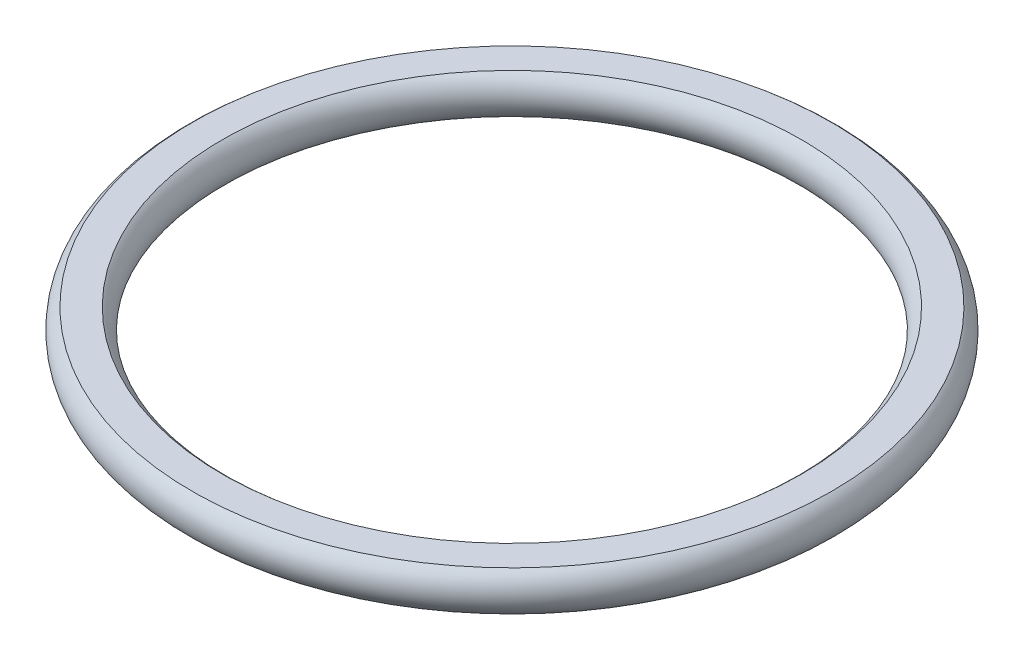
ISO-10303-21;
HEADER;
FILE_DESCRIPTION(('STEP AP214'),'2;1');
FILE_NAME('part.step','',(''),(''),'','','');
FILE_SCHEMA(('AUTOMOTIVE_DESIGN { 1 0 10303 214 1 1 1 1 }'));
ENDSEC;
DATA;
#1=APPLICATION_CONTEXT('core data for automotive mechanical design processes');
#2=APPLICATION_PROTOCOL_DEFINITION('international standard','automotive_design',2000,#1);
#3=PRODUCT_CONTEXT('',#1,'mechanical');
#4=PRODUCT('Part','Part','',(#3));
#5=PRODUCT_RELATED_PRODUCT_CATEGORY('part','',(#4));
#6=PRODUCT_DEFINITION_FORMATION('','',#4);
#7=PRODUCT_DEFINITION_CONTEXT('part definition',#1,'design');
#8=PRODUCT_DEFINITION('design','',#6,#7);
#9=PRODUCT_DEFINITION_SHAPE('','',#8);
#10=(LENGTH_UNIT() NAMED_UNIT(*) SI_UNIT(.MILLI.,.METRE.));
#11=(NAMED_UNIT(*) PLANE_ANGLE_UNIT() SI_UNIT($,.RADIAN.));
#12=(NAMED_UNIT(*) SI_UNIT($,.STERADIAN.) SOLID_ANGLE_UNIT());
#13=UNCERTAINTY_MEASURE_WITH_UNIT(LENGTH_MEASURE(1.E-05),#10,'distance_accuracy_value','');
#14=(GEOMETRIC_REPRESENTATION_CONTEXT(3) GLOBAL_UNCERTAINTY_ASSIGNED_CONTEXT((#13)) GLOBAL_UNIT_ASSIGNED_CONTEXT((#10,
#11,#12)) REPRESENTATION_CONTEXT('',''));
#15=CARTESIAN_POINT('',(0.,0.,0.));
#16=DIRECTION('',(0.,0.,1.));
#17=DIRECTION('',(1.,0.,0.));
#18=AXIS2_PLACEMENT_3D('',#15,#16,#17);
#19=CARTESIAN_POINT('',(30.5,-2.,0.));
#20=DIRECTION('',(0.,-1.,0.));
#21=DIRECTION('',(0.,0.,-1.));
#22=AXIS2_PLACEMENT_3D('',#19,#20,#21);
#23=PLANE('',#22);
#24=CARTESIAN_POINT('',(30.5,-2.,0.));
#25=DIRECTION('',(0.,-1.,0.));
#26=DIRECTION('',(-1.,0.,0.));
#27=AXIS2_PLACEMENT_3D('',#24,#25,#26);
#28=CIRCLE('',#27,29.);
#29=CARTESIAN_POINT('',(59.5,-2.,0.));
#30=VERTEX_POINT('',#29);
#31=EDGE_CURVE('E11',#30,#30,#28,.T.);
#32=ORIENTED_EDGE('',*,*,#31,.F.);
#33=EDGE_LOOP('',(#32));
#34=FACE_BOUND('',#33,.T.);
#35=CARTESIAN_POINT('',(30.5,-2.,0.));
#36=DIRECTION('',(0.,1.,0.));
#37=DIRECTION('',(-1.,0.,0.));
#38=AXIS2_PLACEMENT_3D('',#35,#36,#37);
#39=CIRCLE('',#38,32.);
#40=CARTESIAN_POINT('',(62.5,-2.,0.));
#41=VERTEX_POINT('',#40);
#42=EDGE_CURVE('E53',#41,#41,#39,.T.);
#43=ORIENTED_EDGE('',*,*,#42,.F.);
#44=EDGE_LOOP('',(#43));
#45=FACE_BOUND('',#44,.T.);
#46=ADVANCED_FACE('F17',(#34,#45),#23,.T.);
#47=CARTESIAN_POINT('',(30.5,0.,0.));
#48=DIRECTION('',(0.,-1.,0.));
#49=DIRECTION('',(-1.,0.,0.));
#50=AXIS2_PLACEMENT_3D('',#47,#48,#49);
#51=TOROIDAL_SURFACE('',#50,30.5,2.5);
#52=CARTESIAN_POINT('',(30.5,2.,0.));
#53=DIRECTION('',(0.,-1.,0.));
#54=DIRECTION('',(-1.,0.,0.));
#55=AXIS2_PLACEMENT_3D('',#52,#53,#54);
#56=CIRCLE('',#55,29.);
#57=CARTESIAN_POINT('',(59.5,2.,0.));
#58=VERTEX_POINT('',#57);
#59=EDGE_CURVE('E20',#58,#58,#56,.T.);
#60=ORIENTED_EDGE('',*,*,#59,.F.);
#61=CARTESIAN_POINT('',(61.,0.,0.));
#62=DIRECTION('',(0.,0.,1.));
#63=DIRECTION('',(1.,0.,0.));
#64=AXIS2_PLACEMENT_3D('',#61,#62,#63);
#65=CIRCLE('',#64,2.5);
#66=EDGE_CURVE('E27',#58,#30,#65,.T.);
#67=ORIENTED_EDGE('',*,*,#66,.T.);
#68=ORIENTED_EDGE('',*,*,#31,.T.);
#69=ORIENTED_EDGE('',*,*,#66,.F.);
#70=EDGE_LOOP('',(#60,#67,#68,#69));
#71=FACE_BOUND('',#70,.T.);
#72=ADVANCED_FACE('F76',(#71),#51,.T.);
#73=CARTESIAN_POINT('',(30.5,2.,0.));
#74=DIRECTION('',(0.,-1.,0.));
#75=DIRECTION('',(0.,0.,-1.));
#76=AXIS2_PLACEMENT_3D('',#73,#74,#75);
#77=PLANE('',#76);
#78=ORIENTED_EDGE('',*,*,#59,.T.);
#79=EDGE_LOOP('',(#78));
#80=FACE_BOUND('',#79,.T.);
#81=CARTESIAN_POINT('',(30.5,2.,0.));
#82=DIRECTION('',(0.,-1.,0.));
#83=DIRECTION('',(-1.,0.,0.));
#84=AXIS2_PLACEMENT_3D('',#81,#82,#83);
#85=CIRCLE('',#84,32.);
#86=CARTESIAN_POINT('',(62.5,2.,0.));
#87=VERTEX_POINT('',#86);
#88=EDGE_CURVE('E55',#87,#87,#85,.T.);
#89=ORIENTED_EDGE('',*,*,#88,.F.);
#90=EDGE_LOOP('',(#89));
#91=FACE_BOUND('',#90,.T.);
#92=ADVANCED_FACE('F74',(#80,#91),#77,.F.);
#93=CARTESIAN_POINT('',(30.5,0.,0.));
#94=DIRECTION('',(0.,-1.,0.));
#95=DIRECTION('',(-1.,0.,0.));
#96=AXIS2_PLACEMENT_3D('',#93,#94,#95);
#97=TOROIDAL_SURFACE('',#96,30.5,2.5);
#98=ORIENTED_EDGE('',*,*,#42,.T.);
#99=CARTESIAN_POINT('',(61.,0.,0.));
#100=DIRECTION('',(0.,0.,1.));
#101=DIRECTION('',(1.,0.,0.));
#102=AXIS2_PLACEMENT_3D('',#99,#100,#101);
#103=CIRCLE('',#102,2.5);
#104=EDGE_CURVE('E50',#41,#87,#103,.T.);
#105=ORIENTED_EDGE('',*,*,#104,.T.);
#106=ORIENTED_EDGE('',*,*,#88,.T.);
#107=ORIENTED_EDGE('',*,*,#104,.F.);
#108=EDGE_LOOP('',(#98,#105,#106,#107));
#109=FACE_BOUND('',#108,.T.);
#110=ADVANCED_FACE('F51',(#109),#97,.T.);
#111=CLOSED_SHELL('',(#46,#72,#92,#110));
#112=MANIFOLD_SOLID_BREP('B1',#111);
#113=ADVANCED_BREP_SHAPE_REPRESENTATION('',(#18,#112),#14);
#114=SHAPE_DEFINITION_REPRESENTATION(#9,#113);
ENDSEC;
END-ISO-10303-21;
